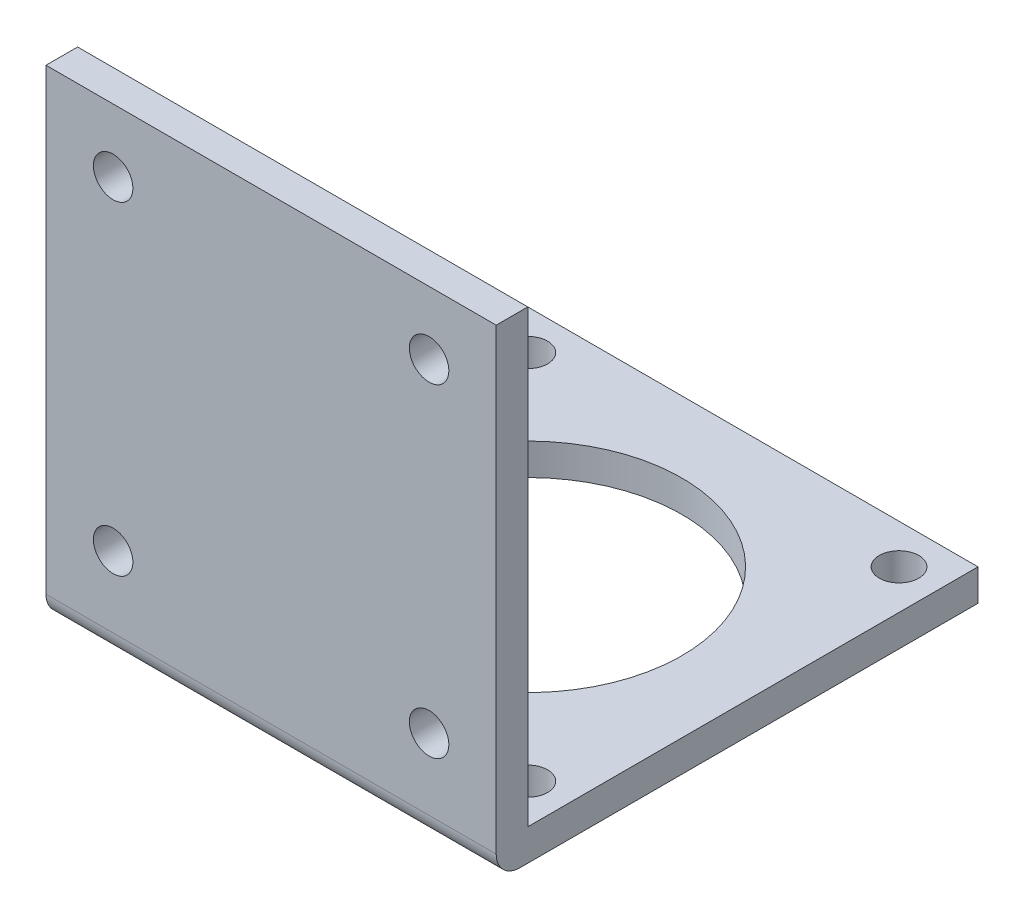
ISO-10303-21;
HEADER;
FILE_DESCRIPTION(('STEP AP214'),'2;1');
FILE_NAME('part.step','',(''),(''),'','','');
FILE_SCHEMA(('AUTOMOTIVE_DESIGN { 1 0 10303 214 1 1 1 1 }'));
ENDSEC;
DATA;
#1=APPLICATION_CONTEXT('core data for automotive mechanical design processes');
#2=APPLICATION_PROTOCOL_DEFINITION('international standard','automotive_design',2000,#1);
#3=PRODUCT_CONTEXT('',#1,'mechanical');
#4=PRODUCT('Part','Part','',(#3));
#5=PRODUCT_RELATED_PRODUCT_CATEGORY('part','',(#4));
#6=PRODUCT_DEFINITION_FORMATION('','',#4);
#7=PRODUCT_DEFINITION_CONTEXT('part definition',#1,'design');
#8=PRODUCT_DEFINITION('design','',#6,#7);
#9=PRODUCT_DEFINITION_SHAPE('','',#8);
#10=(LENGTH_UNIT() NAMED_UNIT(*) SI_UNIT(.MILLI.,.METRE.));
#11=(NAMED_UNIT(*) PLANE_ANGLE_UNIT() SI_UNIT($,.RADIAN.));
#12=(NAMED_UNIT(*) SI_UNIT($,.STERADIAN.) SOLID_ANGLE_UNIT());
#13=UNCERTAINTY_MEASURE_WITH_UNIT(LENGTH_MEASURE(1.E-05),#10,'distance_accuracy_value','');
#14=(GEOMETRIC_REPRESENTATION_CONTEXT(3) GLOBAL_UNCERTAINTY_ASSIGNED_CONTEXT((#13)) GLOBAL_UNIT_ASSIGNED_CONTEXT((#10,
#11,#12)) REPRESENTATION_CONTEXT('',''));
#15=CARTESIAN_POINT('',(0.,0.,0.));
#16=DIRECTION('',(0.,0.,1.));
#17=DIRECTION('',(1.,0.,0.));
#18=AXIS2_PLACEMENT_3D('',#15,#16,#17);
#19=CARTESIAN_POINT('',(57.,0.,-4.));
#20=DIRECTION('',(0.,-1.,0.));
#21=DIRECTION('',(0.,0.,-1.));
#22=AXIS2_PLACEMENT_3D('',#19,#20,#21);
#23=PLANE('',#22);
#24=DIRECTION('',(0.,0.,1.));
#25=VECTOR('',#24,1.);
#26=CARTESIAN_POINT('',(0.,0.,-4.));
#27=LINE('',#26,#25);
#28=CARTESIAN_POINT('',(0.,0.,-4.));
#29=VERTEX_POINT('',#28);
#30=CARTESIAN_POINT('',(0.,0.,0.));
#31=VERTEX_POINT('',#30);
#32=EDGE_CURVE('E113',#29,#31,#27,.T.);
#33=ORIENTED_EDGE('',*,*,#32,.T.);
#34=DIRECTION('',(-1.,0.,0.));
#35=VECTOR('',#34,1.);
#36=CARTESIAN_POINT('',(57.,0.,0.));
#37=LINE('',#36,#35);
#38=CARTESIAN_POINT('',(57.,0.,0.));
#39=VERTEX_POINT('',#38);
#40=EDGE_CURVE('E96',#39,#31,#37,.T.);
#41=ORIENTED_EDGE('',*,*,#40,.F.);
#42=DIRECTION('',(0.,0.,1.));
#43=VECTOR('',#42,1.);
#44=CARTESIAN_POINT('',(57.,0.,-4.));
#45=LINE('',#44,#43);
#46=CARTESIAN_POINT('',(57.,0.,-4.));
#47=VERTEX_POINT('',#46);
#48=EDGE_CURVE('E101',#47,#39,#45,.T.);
#49=ORIENTED_EDGE('',*,*,#48,.F.);
#50=DIRECTION('',(-1.,0.,0.));
#51=VECTOR('',#50,1.);
#52=CARTESIAN_POINT('',(57.,0.,-4.));
#53=LINE('',#52,#51);
#54=EDGE_CURVE('E129',#47,#29,#53,.T.);
#55=ORIENTED_EDGE('',*,*,#54,.T.);
#56=EDGE_LOOP('',(#33,#41,#49,#55));
#57=FACE_BOUND('',#56,.T.);
#58=ADVANCED_FACE('F37',(#57),#23,.F.);
#59=CARTESIAN_POINT('',(57.,0.,0.));
#60=DIRECTION('',(0.,0.,-1.));
#61=DIRECTION('',(0.,1.,0.));
#62=AXIS2_PLACEMENT_3D('',#59,#60,#61);
#63=PLANE('',#62);
#64=CARTESIAN_POINT('',(8.5,-7.99999999999999,0.));
#65=DIRECTION('',(0.,0.,-1.));
#66=DIRECTION('',(0.,1.,0.));
#67=AXIS2_PLACEMENT_3D('',#64,#65,#66);
#68=CIRCLE('',#67,2.5);
#69=CARTESIAN_POINT('',(8.5,-5.49999999999999,0.));
#70=VERTEX_POINT('',#69);
#71=EDGE_CURVE('E188',#70,#70,#68,.F.);
#72=ORIENTED_EDGE('',*,*,#71,.F.);
#73=EDGE_LOOP('',(#72));
#74=FACE_BOUND('',#73,.T.);
#75=CARTESIAN_POINT('',(8.49999999999999,-49.,0.));
#76=DIRECTION('',(0.,0.,-1.));
#77=DIRECTION('',(0.,1.,0.));
#78=AXIS2_PLACEMENT_3D('',#75,#76,#77);
#79=CIRCLE('',#78,2.5);
#80=CARTESIAN_POINT('',(8.49999999999999,-46.5,0.));
#81=VERTEX_POINT('',#80);
#82=EDGE_CURVE('E187',#81,#81,#79,.F.);
#83=ORIENTED_EDGE('',*,*,#82,.F.);
#84=EDGE_LOOP('',(#83));
#85=FACE_BOUND('',#84,.T.);
#86=CARTESIAN_POINT('',(48.5,-49.,0.));
#87=DIRECTION('',(0.,0.,-1.));
#88=DIRECTION('',(0.,1.,0.));
#89=AXIS2_PLACEMENT_3D('',#86,#87,#88);
#90=CIRCLE('',#89,2.5);
#91=CARTESIAN_POINT('',(48.5,-46.5,0.));
#92=VERTEX_POINT('',#91);
#93=EDGE_CURVE('E194',#92,#92,#90,.F.);
#94=ORIENTED_EDGE('',*,*,#93,.F.);
#95=EDGE_LOOP('',(#94));
#96=FACE_BOUND('',#95,.T.);
#97=CARTESIAN_POINT('',(48.5,-7.99999999999999,0.));
#98=DIRECTION('',(0.,0.,-1.));
#99=DIRECTION('',(0.,1.,0.));
#100=AXIS2_PLACEMENT_3D('',#97,#98,#99);
#101=CIRCLE('',#100,2.5);
#102=CARTESIAN_POINT('',(48.5,-5.49999999999999,0.));
#103=VERTEX_POINT('',#102);
#104=EDGE_CURVE('E161',#103,#103,#101,.F.);
#105=ORIENTED_EDGE('',*,*,#104,.F.);
#106=EDGE_LOOP('',(#105));
#107=FACE_BOUND('',#106,.T.);
#108=DIRECTION('',(0.,-1.,0.));
#109=VECTOR('',#108,1.);
#110=CARTESIAN_POINT('',(0.,0.,0.));
#111=LINE('',#110,#109);
#112=CARTESIAN_POINT('',(0.,-58.,0.));
#113=VERTEX_POINT('',#112);
#114=EDGE_CURVE('E138',#31,#113,#111,.T.);
#115=ORIENTED_EDGE('',*,*,#114,.T.);
#116=DIRECTION('',(-1.,0.,0.));
#117=VECTOR('',#116,1.);
#118=CARTESIAN_POINT('',(57.,-58.,0.));
#119=LINE('',#118,#117);
#120=CARTESIAN_POINT('',(57.,-58.,0.));
#121=VERTEX_POINT('',#120);
#122=EDGE_CURVE('E45',#113,#121,#119,.F.);
#123=ORIENTED_EDGE('',*,*,#122,.T.);
#124=DIRECTION('',(0.,-1.,0.));
#125=VECTOR('',#124,1.);
#126=CARTESIAN_POINT('',(57.,0.,0.));
#127=LINE('',#126,#125);
#128=EDGE_CURVE('E92',#39,#121,#127,.T.);
#129=ORIENTED_EDGE('',*,*,#128,.F.);
#130=ORIENTED_EDGE('',*,*,#40,.T.);
#131=EDGE_LOOP('',(#115,#123,#129,#130));
#132=FACE_BOUND('',#131,.T.);
#133=ADVANCED_FACE('F94',(#74,#85,#96,#107,#132),#63,.F.);
#134=CARTESIAN_POINT('',(57.,-61.,0.));
#135=DIRECTION('',(0.,1.,0.));
#136=DIRECTION('',(0.,0.,1.));
#137=AXIS2_PLACEMENT_3D('',#134,#135,#136);
#138=PLANE('',#137);
#139=CARTESIAN_POINT('',(28.5,-61.,-32.5));
#140=DIRECTION('',(0.,1.,0.));
#141=DIRECTION('',(0.,0.,1.));
#142=AXIS2_PLACEMENT_3D('',#139,#140,#141);
#143=CIRCLE('',#142,19.5);
#144=CARTESIAN_POINT('',(28.5,-61.,-13.));
#145=VERTEX_POINT('',#144);
#146=EDGE_CURVE('E158',#145,#145,#143,.F.);
#147=ORIENTED_EDGE('',*,*,#146,.F.);
#148=EDGE_LOOP('',(#147));
#149=FACE_BOUND('',#148,.T.);
#150=CARTESIAN_POINT('',(52.,-61.,-56.));
#151=DIRECTION('',(0.,1.,0.));
#152=DIRECTION('',(0.,0.,1.));
#153=AXIS2_PLACEMENT_3D('',#150,#151,#152);
#154=CIRCLE('',#153,2.5);
#155=CARTESIAN_POINT('',(52.,-61.,-53.5));
#156=VERTEX_POINT('',#155);
#157=EDGE_CURVE('E157',#156,#156,#154,.F.);
#158=ORIENTED_EDGE('',*,*,#157,.F.);
#159=EDGE_LOOP('',(#158));
#160=FACE_BOUND('',#159,.T.);
#161=CARTESIAN_POINT('',(52.,-61.,-9.00000000000001));
#162=DIRECTION('',(0.,1.,0.));
#163=DIRECTION('',(0.,0.,1.));
#164=AXIS2_PLACEMENT_3D('',#161,#162,#163);
#165=CIRCLE('',#164,2.49999999999999);
#166=CARTESIAN_POINT('',(52.,-61.,-6.50000000000002));
#167=VERTEX_POINT('',#166);
#168=EDGE_CURVE('E165',#167,#167,#165,.F.);
#169=ORIENTED_EDGE('',*,*,#168,.F.);
#170=EDGE_LOOP('',(#169));
#171=FACE_BOUND('',#170,.T.);
#172=CARTESIAN_POINT('',(4.99999999999999,-61.,-9.00000000000001));
#173=DIRECTION('',(0.,1.,0.));
#174=DIRECTION('',(0.,0.,1.));
#175=AXIS2_PLACEMENT_3D('',#172,#173,#174);
#176=CIRCLE('',#175,2.5);
#177=CARTESIAN_POINT('',(4.99999999999999,-61.,-6.50000000000001));
#178=VERTEX_POINT('',#177);
#179=EDGE_CURVE('E171',#178,#178,#176,.F.);
#180=ORIENTED_EDGE('',*,*,#179,.F.);
#181=EDGE_LOOP('',(#180));
#182=FACE_BOUND('',#181,.T.);
#183=CARTESIAN_POINT('',(4.99999999999999,-61.,-56.));
#184=DIRECTION('',(0.,1.,0.));
#185=DIRECTION('',(0.,0.,1.));
#186=AXIS2_PLACEMENT_3D('',#183,#184,#185);
#187=CIRCLE('',#186,2.5);
#188=CARTESIAN_POINT('',(4.99999999999999,-61.,-53.5));
#189=VERTEX_POINT('',#188);
#190=EDGE_CURVE('E141',#189,#189,#187,.F.);
#191=ORIENTED_EDGE('',*,*,#190,.F.);
#192=EDGE_LOOP('',(#191));
#193=FACE_BOUND('',#192,.T.);
#194=DIRECTION('',(0.,0.,-1.));
#195=VECTOR('',#194,1.);
#196=CARTESIAN_POINT('',(57.,-61.,0.));
#197=LINE('',#196,#195);
#198=CARTESIAN_POINT('',(57.,-61.,-3.00000000000001));
#199=VERTEX_POINT('',#198);
#200=CARTESIAN_POINT('',(57.,-61.,-61.));
#201=VERTEX_POINT('',#200);
#202=EDGE_CURVE('E100',#199,#201,#197,.T.);
#203=ORIENTED_EDGE('',*,*,#202,.F.);
#204=DIRECTION('',(-1.,0.,0.));
#205=VECTOR('',#204,1.);
#206=CARTESIAN_POINT('',(57.,-61.,-3.00000000000001));
#207=LINE('',#206,#205);
#208=CARTESIAN_POINT('',(0.,-61.,-3.00000000000001));
#209=VERTEX_POINT('',#208);
#210=EDGE_CURVE('E114',#199,#209,#207,.T.);
#211=ORIENTED_EDGE('',*,*,#210,.T.);
#212=DIRECTION('',(0.,0.,-1.));
#213=VECTOR('',#212,1.);
#214=CARTESIAN_POINT('',(0.,-61.,0.));
#215=LINE('',#214,#213);
#216=CARTESIAN_POINT('',(0.,-61.,-61.));
#217=VERTEX_POINT('',#216);
#218=EDGE_CURVE('E136',#209,#217,#215,.T.);
#219=ORIENTED_EDGE('',*,*,#218,.T.);
#220=DIRECTION('',(-1.,0.,0.));
#221=VECTOR('',#220,1.);
#222=CARTESIAN_POINT('',(57.,-61.,-61.));
#223=LINE('',#222,#221);
#224=EDGE_CURVE('E115',#201,#217,#223,.T.);
#225=ORIENTED_EDGE('',*,*,#224,.F.);
#226=EDGE_LOOP('',(#203,#211,#219,#225));
#227=FACE_BOUND('',#226,.T.);
#228=ADVANCED_FACE('F207',(#149,#160,#171,#182,#193,#227),#138,.F.);
#229=CARTESIAN_POINT('',(57.,-61.,-61.));
#230=DIRECTION('',(0.,0.,1.));
#231=DIRECTION('',(1.,0.,0.));
#232=AXIS2_PLACEMENT_3D('',#229,#230,#231);
#233=PLANE('',#232);
#234=DIRECTION('',(0.,1.,0.));
#235=VECTOR('',#234,1.);
#236=CARTESIAN_POINT('',(0.,-61.,-61.));
#237=LINE('',#236,#235);
#238=CARTESIAN_POINT('',(0.,-57.,-61.));
#239=VERTEX_POINT('',#238);
#240=EDGE_CURVE('E134',#217,#239,#237,.T.);
#241=ORIENTED_EDGE('',*,*,#240,.T.);
#242=DIRECTION('',(-1.,0.,0.));
#243=VECTOR('',#242,1.);
#244=CARTESIAN_POINT('',(57.,-57.,-61.));
#245=LINE('',#244,#243);
#246=CARTESIAN_POINT('',(57.,-57.,-61.));
#247=VERTEX_POINT('',#246);
#248=EDGE_CURVE('E120',#247,#239,#245,.T.);
#249=ORIENTED_EDGE('',*,*,#248,.F.);
#250=DIRECTION('',(0.,1.,0.));
#251=VECTOR('',#250,1.);
#252=CARTESIAN_POINT('',(57.,-61.,-61.));
#253=LINE('',#252,#251);
#254=EDGE_CURVE('E145',#201,#247,#253,.T.);
#255=ORIENTED_EDGE('',*,*,#254,.F.);
#256=ORIENTED_EDGE('',*,*,#224,.T.);
#257=EDGE_LOOP('',(#241,#249,#255,#256));
#258=FACE_BOUND('',#257,.T.);
#259=ADVANCED_FACE('F238',(#258),#233,.F.);
#260=CARTESIAN_POINT('',(57.,-57.,-61.));
#261=DIRECTION('',(0.,-1.,0.));
#262=DIRECTION('',(0.,0.,-1.));
#263=AXIS2_PLACEMENT_3D('',#260,#261,#262);
#264=PLANE('',#263);
#265=CARTESIAN_POINT('',(28.5,-57.,-32.5));
#266=DIRECTION('',(0.,1.,0.));
#267=DIRECTION('',(0.,0.,1.));
#268=AXIS2_PLACEMENT_3D('',#265,#266,#267);
#269=CIRCLE('',#268,19.5);
#270=CARTESIAN_POINT('',(28.5,-57.,-13.));
#271=VERTEX_POINT('',#270);
#272=EDGE_CURVE('E154',#271,#271,#269,.T.);
#273=ORIENTED_EDGE('',*,*,#272,.F.);
#274=EDGE_LOOP('',(#273));
#275=FACE_BOUND('',#274,.T.);
#276=CARTESIAN_POINT('',(52.,-57.,-56.));
#277=DIRECTION('',(0.,1.,0.));
#278=DIRECTION('',(0.,0.,-1.));
#279=AXIS2_PLACEMENT_3D('',#276,#277,#278);
#280=CIRCLE('',#279,2.5);
#281=CARTESIAN_POINT('',(52.,-57.,-58.5));
#282=VERTEX_POINT('',#281);
#283=EDGE_CURVE('E162',#282,#282,#280,.T.);
#284=ORIENTED_EDGE('',*,*,#283,.F.);
#285=EDGE_LOOP('',(#284));
#286=FACE_BOUND('',#285,.T.);
#287=CARTESIAN_POINT('',(52.,-57.,-9.00000000000001));
#288=DIRECTION('',(0.,1.,0.));
#289=DIRECTION('',(0.,0.,-1.));
#290=AXIS2_PLACEMENT_3D('',#287,#288,#289);
#291=CIRCLE('',#290,2.49999999999999);
#292=CARTESIAN_POINT('',(52.,-57.,-11.5));
#293=VERTEX_POINT('',#292);
#294=EDGE_CURVE('E168',#293,#293,#291,.T.);
#295=ORIENTED_EDGE('',*,*,#294,.F.);
#296=EDGE_LOOP('',(#295));
#297=FACE_BOUND('',#296,.T.);
#298=CARTESIAN_POINT('',(4.99999999999999,-57.,-9.00000000000001));
#299=DIRECTION('',(0.,1.,0.));
#300=DIRECTION('',(0.,0.,1.));
#301=AXIS2_PLACEMENT_3D('',#298,#299,#300);
#302=CIRCLE('',#301,2.5);
#303=CARTESIAN_POINT('',(4.99999999999999,-57.,-6.50000000000001));
#304=VERTEX_POINT('',#303);
#305=EDGE_CURVE('E153',#304,#304,#302,.T.);
#306=ORIENTED_EDGE('',*,*,#305,.F.);
#307=EDGE_LOOP('',(#306));
#308=FACE_BOUND('',#307,.T.);
#309=CARTESIAN_POINT('',(4.99999999999999,-57.,-56.));
#310=DIRECTION('',(0.,1.,0.));
#311=DIRECTION('',(0.,0.,1.));
#312=AXIS2_PLACEMENT_3D('',#309,#310,#311);
#313=CIRCLE('',#312,2.5);
#314=CARTESIAN_POINT('',(4.99999999999999,-57.,-53.5));
#315=VERTEX_POINT('',#314);
#316=EDGE_CURVE('E150',#315,#315,#313,.T.);
#317=ORIENTED_EDGE('',*,*,#316,.F.);
#318=EDGE_LOOP('',(#317));
#319=FACE_BOUND('',#318,.T.);
#320=DIRECTION('',(0.,0.,1.));
#321=VECTOR('',#320,1.);
#322=CARTESIAN_POINT('',(0.,-57.,-61.));
#323=LINE('',#322,#321);
#324=CARTESIAN_POINT('',(0.,-57.,-4.));
#325=VERTEX_POINT('',#324);
#326=EDGE_CURVE('E132',#239,#325,#323,.T.);
#327=ORIENTED_EDGE('',*,*,#326,.T.);
#328=DIRECTION('',(-1.,0.,0.));
#329=VECTOR('',#328,1.);
#330=CARTESIAN_POINT('',(57.,-57.,-4.));
#331=LINE('',#330,#329);
#332=CARTESIAN_POINT('',(57.,-57.,-4.));
#333=VERTEX_POINT('',#332);
#334=EDGE_CURVE('E126',#333,#325,#331,.T.);
#335=ORIENTED_EDGE('',*,*,#334,.F.);
#336=DIRECTION('',(0.,0.,1.));
#337=VECTOR('',#336,1.);
#338=CARTESIAN_POINT('',(57.,-57.,-61.));
#339=LINE('',#338,#337);
#340=EDGE_CURVE('E143',#247,#333,#339,.T.);
#341=ORIENTED_EDGE('',*,*,#340,.F.);
#342=ORIENTED_EDGE('',*,*,#248,.T.);
#343=EDGE_LOOP('',(#327,#335,#341,#342));
#344=FACE_BOUND('',#343,.T.);
#345=ADVANCED_FACE('F222',(#275,#286,#297,#308,#319,#344),#264,.F.);
#346=CARTESIAN_POINT('',(57.,-57.,-4.));
#347=DIRECTION('',(0.,0.,1.));
#348=DIRECTION('',(1.,0.,0.));
#349=AXIS2_PLACEMENT_3D('',#346,#347,#348);
#350=PLANE('',#349);
#351=CARTESIAN_POINT('',(8.5,-7.99999999999999,-4.));
#352=DIRECTION('',(0.,0.,-1.));
#353=DIRECTION('',(1.,0.,0.));
#354=AXIS2_PLACEMENT_3D('',#351,#352,#353);
#355=CIRCLE('',#354,2.5);
#356=CARTESIAN_POINT('',(11.,-7.99999999999999,-4.));
#357=VERTEX_POINT('',#356);
#358=EDGE_CURVE('E184',#357,#357,#355,.T.);
#359=ORIENTED_EDGE('',*,*,#358,.F.);
#360=EDGE_LOOP('',(#359));
#361=FACE_BOUND('',#360,.T.);
#362=CARTESIAN_POINT('',(8.49999999999999,-49.,-4.));
#363=DIRECTION('',(0.,0.,-1.));
#364=DIRECTION('',(1.,0.,0.));
#365=AXIS2_PLACEMENT_3D('',#362,#363,#364);
#366=CIRCLE('',#365,2.5);
#367=CARTESIAN_POINT('',(11.,-49.,-4.));
#368=VERTEX_POINT('',#367);
#369=EDGE_CURVE('E191',#368,#368,#366,.T.);
#370=ORIENTED_EDGE('',*,*,#369,.F.);
#371=EDGE_LOOP('',(#370));
#372=FACE_BOUND('',#371,.T.);
#373=CARTESIAN_POINT('',(48.5,-49.,-4.));
#374=DIRECTION('',(0.,0.,-1.));
#375=DIRECTION('',(-1.,0.,0.));
#376=AXIS2_PLACEMENT_3D('',#373,#374,#375);
#377=CIRCLE('',#376,2.5);
#378=CARTESIAN_POINT('',(46.,-49.,-4.));
#379=VERTEX_POINT('',#378);
#380=EDGE_CURVE('E183',#379,#379,#377,.T.);
#381=ORIENTED_EDGE('',*,*,#380,.F.);
#382=EDGE_LOOP('',(#381));
#383=FACE_BOUND('',#382,.T.);
#384=CARTESIAN_POINT('',(48.5,-7.99999999999999,-4.));
#385=DIRECTION('',(0.,0.,-1.));
#386=DIRECTION('',(-1.,0.,0.));
#387=AXIS2_PLACEMENT_3D('',#384,#385,#386);
#388=CIRCLE('',#387,2.5);
#389=CARTESIAN_POINT('',(46.,-7.99999999999999,-4.));
#390=VERTEX_POINT('',#389);
#391=EDGE_CURVE('E180',#390,#390,#388,.T.);
#392=ORIENTED_EDGE('',*,*,#391,.F.);
#393=EDGE_LOOP('',(#392));
#394=FACE_BOUND('',#393,.T.);
#395=DIRECTION('',(0.,1.,0.));
#396=VECTOR('',#395,1.);
#397=CARTESIAN_POINT('',(0.,-57.,-4.));
#398=LINE('',#397,#396);
#399=EDGE_CURVE('E110',#325,#29,#398,.T.);
#400=ORIENTED_EDGE('',*,*,#399,.T.);
#401=ORIENTED_EDGE('',*,*,#54,.F.);
#402=DIRECTION('',(0.,1.,0.));
#403=VECTOR('',#402,1.);
#404=CARTESIAN_POINT('',(57.,-57.,-4.));
#405=LINE('',#404,#403);
#406=EDGE_CURVE('E106',#333,#47,#405,.T.);
#407=ORIENTED_EDGE('',*,*,#406,.F.);
#408=ORIENTED_EDGE('',*,*,#334,.T.);
#409=EDGE_LOOP('',(#400,#401,#407,#408));
#410=FACE_BOUND('',#409,.T.);
#411=ADVANCED_FACE('F219',(#361,#372,#383,#394,#410),#350,.F.);
#412=CARTESIAN_POINT('',(57.,0.,0.));
#413=DIRECTION('',(1.,0.,0.));
#414=DIRECTION('',(0.,0.,-1.));
#415=AXIS2_PLACEMENT_3D('',#412,#413,#414);
#416=PLANE('',#415);
#417=ORIENTED_EDGE('',*,*,#128,.T.);
#418=CARTESIAN_POINT('',(57.,-58.,-3.00000000000001));
#419=DIRECTION('',(1.,0.,0.));
#420=DIRECTION('',(0.,0.,-1.));
#421=AXIS2_PLACEMENT_3D('',#418,#419,#420);
#422=CIRCLE('',#421,3.);
#423=EDGE_CURVE('E11',#121,#199,#422,.T.);
#424=ORIENTED_EDGE('',*,*,#423,.T.);
#425=ORIENTED_EDGE('',*,*,#202,.T.);
#426=ORIENTED_EDGE('',*,*,#254,.T.);
#427=ORIENTED_EDGE('',*,*,#340,.T.);
#428=ORIENTED_EDGE('',*,*,#406,.T.);
#429=ORIENTED_EDGE('',*,*,#48,.T.);
#430=EDGE_LOOP('',(#417,#424,#425,#426,#427,#428,#429));
#431=FACE_BOUND('',#430,.T.);
#432=ADVANCED_FACE('F104',(#431),#416,.T.);
#433=CARTESIAN_POINT('',(0.,0.,0.));
#434=DIRECTION('',(1.,0.,0.));
#435=DIRECTION('',(0.,0.,-1.));
#436=AXIS2_PLACEMENT_3D('',#433,#434,#435);
#437=PLANE('',#436);
#438=ORIENTED_EDGE('',*,*,#218,.F.);
#439=CARTESIAN_POINT('',(0.,-58.,-3.00000000000001));
#440=DIRECTION('',(1.,0.,0.));
#441=DIRECTION('',(0.,0.,-1.));
#442=AXIS2_PLACEMENT_3D('',#439,#440,#441);
#443=CIRCLE('',#442,3.);
#444=EDGE_CURVE('E59',#209,#113,#443,.F.);
#445=ORIENTED_EDGE('',*,*,#444,.T.);
#446=ORIENTED_EDGE('',*,*,#114,.F.);
#447=ORIENTED_EDGE('',*,*,#32,.F.);
#448=ORIENTED_EDGE('',*,*,#399,.F.);
#449=ORIENTED_EDGE('',*,*,#326,.F.);
#450=ORIENTED_EDGE('',*,*,#240,.F.);
#451=EDGE_LOOP('',(#438,#445,#446,#447,#448,#449,#450));
#452=FACE_BOUND('',#451,.T.);
#453=ADVANCED_FACE('F228',(#452),#437,.F.);
#454=CARTESIAN_POINT('',(57.,-58.,-3.00000000000001));
#455=DIRECTION('',(-1.,0.,0.));
#456=DIRECTION('',(0.,0.,1.));
#457=AXIS2_PLACEMENT_3D('',#454,#455,#456);
#458=CYLINDRICAL_SURFACE('',#457,3.);
#459=ORIENTED_EDGE('',*,*,#423,.F.);
#460=ORIENTED_EDGE('',*,*,#122,.F.);
#461=ORIENTED_EDGE('',*,*,#444,.F.);
#462=ORIENTED_EDGE('',*,*,#210,.F.);
#463=EDGE_LOOP('',(#459,#460,#461,#462));
#464=FACE_BOUND('',#463,.T.);
#465=ADVANCED_FACE('F39',(#464),#458,.T.);
#466=CARTESIAN_POINT('',(4.99999999999999,-116.154328932551,-56.));
#467=DIRECTION('',(0.,1.,0.));
#468=DIRECTION('',(0.,0.,1.));
#469=AXIS2_PLACEMENT_3D('',#466,#467,#468);
#470=CYLINDRICAL_SURFACE('',#469,2.5);
#471=ORIENTED_EDGE('',*,*,#190,.T.);
#472=EDGE_LOOP('',(#471));
#473=FACE_BOUND('',#472,.T.);
#474=ORIENTED_EDGE('',*,*,#316,.T.);
#475=EDGE_LOOP('',(#474));
#476=FACE_BOUND('',#475,.T.);
#477=ADVANCED_FACE('F268',(#473,#476),#470,.F.);
#478=CARTESIAN_POINT('',(4.99999999999999,-116.154328932551,-9.00000000000001));
#479=DIRECTION('',(0.,1.,0.));
#480=DIRECTION('',(0.,0.,1.));
#481=AXIS2_PLACEMENT_3D('',#478,#479,#480);
#482=CYLINDRICAL_SURFACE('',#481,2.5);
#483=ORIENTED_EDGE('',*,*,#179,.T.);
#484=EDGE_LOOP('',(#483));
#485=FACE_BOUND('',#484,.T.);
#486=ORIENTED_EDGE('',*,*,#305,.T.);
#487=EDGE_LOOP('',(#486));
#488=FACE_BOUND('',#487,.T.);
#489=ADVANCED_FACE('F271',(#485,#488),#482,.F.);
#490=CARTESIAN_POINT('',(52.,-116.154328932551,-9.00000000000002));
#491=DIRECTION('',(0.,1.,0.));
#492=DIRECTION('',(0.,0.,1.));
#493=AXIS2_PLACEMENT_3D('',#490,#491,#492);
#494=CYLINDRICAL_SURFACE('',#493,2.49999999999999);
#495=ORIENTED_EDGE('',*,*,#168,.T.);
#496=EDGE_LOOP('',(#495));
#497=FACE_BOUND('',#496,.T.);
#498=ORIENTED_EDGE('',*,*,#294,.T.);
#499=EDGE_LOOP('',(#498));
#500=FACE_BOUND('',#499,.T.);
#501=ADVANCED_FACE('F279',(#497,#500),#494,.F.);
#502=CARTESIAN_POINT('',(52.,-116.154328932551,-56.));
#503=DIRECTION('',(0.,1.,0.));
#504=DIRECTION('',(0.,0.,1.));
#505=AXIS2_PLACEMENT_3D('',#502,#503,#504);
#506=CYLINDRICAL_SURFACE('',#505,2.5);
#507=ORIENTED_EDGE('',*,*,#157,.T.);
#508=EDGE_LOOP('',(#507));
#509=FACE_BOUND('',#508,.T.);
#510=ORIENTED_EDGE('',*,*,#283,.T.);
#511=EDGE_LOOP('',(#510));
#512=FACE_BOUND('',#511,.T.);
#513=ADVANCED_FACE('F331',(#509,#512),#506,.F.);
#514=CARTESIAN_POINT('',(28.5,-116.154328932551,-32.5));
#515=DIRECTION('',(0.,1.,0.));
#516=DIRECTION('',(0.,0.,1.));
#517=AXIS2_PLACEMENT_3D('',#514,#515,#516);
#518=CYLINDRICAL_SURFACE('',#517,19.5);
#519=ORIENTED_EDGE('',*,*,#146,.T.);
#520=EDGE_LOOP('',(#519));
#521=FACE_BOUND('',#520,.T.);
#522=ORIENTED_EDGE('',*,*,#272,.T.);
#523=EDGE_LOOP('',(#522));
#524=FACE_BOUND('',#523,.T.);
#525=ADVANCED_FACE('F215',(#521,#524),#518,.F.);
#526=CARTESIAN_POINT('',(48.5,-7.99999999999999,7.07106781186548));
#527=DIRECTION('',(0.,0.,-1.));
#528=DIRECTION('',(-1.,0.,0.));
#529=AXIS2_PLACEMENT_3D('',#526,#527,#528);
#530=CYLINDRICAL_SURFACE('',#529,2.5);
#531=ORIENTED_EDGE('',*,*,#104,.T.);
#532=EDGE_LOOP('',(#531));
#533=FACE_BOUND('',#532,.T.);
#534=ORIENTED_EDGE('',*,*,#391,.T.);
#535=EDGE_LOOP('',(#534));
#536=FACE_BOUND('',#535,.T.);
#537=ADVANCED_FACE('F212',(#533,#536),#530,.F.);
#538=CARTESIAN_POINT('',(48.5,-49.,7.07106781186548));
#539=DIRECTION('',(0.,0.,-1.));
#540=DIRECTION('',(-1.,0.,0.));
#541=AXIS2_PLACEMENT_3D('',#538,#539,#540);
#542=CYLINDRICAL_SURFACE('',#541,2.5);
#543=ORIENTED_EDGE('',*,*,#93,.T.);
#544=EDGE_LOOP('',(#543));
#545=FACE_BOUND('',#544,.T.);
#546=ORIENTED_EDGE('',*,*,#380,.T.);
#547=EDGE_LOOP('',(#546));
#548=FACE_BOUND('',#547,.T.);
#549=ADVANCED_FACE('F202',(#545,#548),#542,.F.);
#550=CARTESIAN_POINT('',(8.49999999999999,-49.,7.07106781186548));
#551=DIRECTION('',(0.,0.,-1.));
#552=DIRECTION('',(-1.,0.,0.));
#553=AXIS2_PLACEMENT_3D('',#550,#551,#552);
#554=CYLINDRICAL_SURFACE('',#553,2.5);
#555=ORIENTED_EDGE('',*,*,#82,.T.);
#556=EDGE_LOOP('',(#555));
#557=FACE_BOUND('',#556,.T.);
#558=ORIENTED_EDGE('',*,*,#369,.T.);
#559=EDGE_LOOP('',(#558));
#560=FACE_BOUND('',#559,.T.);
#561=ADVANCED_FACE('F381',(#557,#560),#554,.F.);
#562=CARTESIAN_POINT('',(8.5,-7.99999999999999,7.07106781186548));
#563=DIRECTION('',(0.,0.,-1.));
#564=DIRECTION('',(-1.,0.,0.));
#565=AXIS2_PLACEMENT_3D('',#562,#563,#564);
#566=CYLINDRICAL_SURFACE('',#565,2.5);
#567=ORIENTED_EDGE('',*,*,#71,.T.);
#568=EDGE_LOOP('',(#567));
#569=FACE_BOUND('',#568,.T.);
#570=ORIENTED_EDGE('',*,*,#358,.T.);
#571=EDGE_LOOP('',(#570));
#572=FACE_BOUND('',#571,.T.);
#573=ADVANCED_FACE('F391',(#569,#572),#566,.F.);
#574=CLOSED_SHELL('',(#58,#133,#228,#259,#345,#411,#432,#453,#465,#477,#489,#501,#513,#525,#537,
#549,#561,#573));
#575=MANIFOLD_SOLID_BREP('B2',#574);
#576=ADVANCED_BREP_SHAPE_REPRESENTATION('',(#18,#575),#14);
#577=SHAPE_DEFINITION_REPRESENTATION(#9,#576);
ENDSEC;
END-ISO-10303-21;
